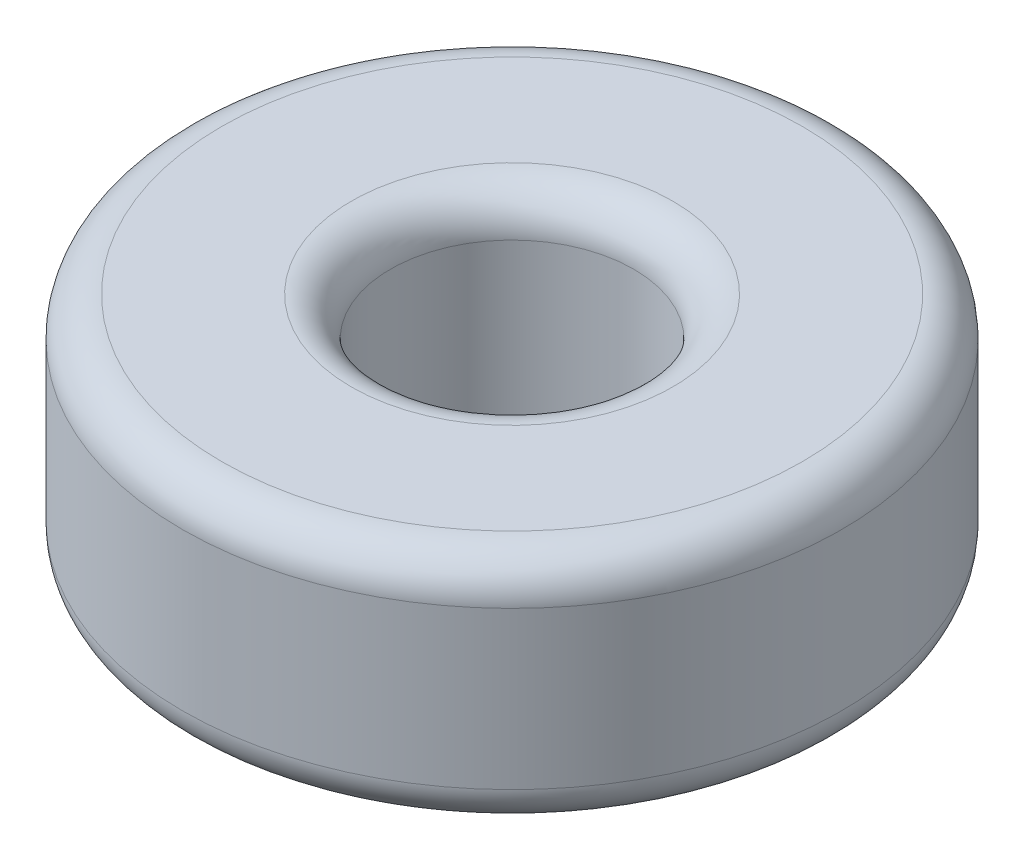
ISO-10303-21;
HEADER;
FILE_DESCRIPTION(('STEP AP214'),'2;1');
FILE_NAME('part.step','',(''),(''),'','','');
FILE_SCHEMA(('AUTOMOTIVE_DESIGN { 1 0 10303 214 1 1 1 1 }'));
ENDSEC;
DATA;
#1=APPLICATION_CONTEXT('core data for automotive mechanical design processes');
#2=APPLICATION_PROTOCOL_DEFINITION('international standard','automotive_design',2000,#1);
#3=PRODUCT_CONTEXT('',#1,'mechanical');
#4=PRODUCT('Part','Part','',(#3));
#5=PRODUCT_RELATED_PRODUCT_CATEGORY('part','',(#4));
#6=PRODUCT_DEFINITION_FORMATION('','',#4);
#7=PRODUCT_DEFINITION_CONTEXT('part definition',#1,'design');
#8=PRODUCT_DEFINITION('design','',#6,#7);
#9=PRODUCT_DEFINITION_SHAPE('','',#8);
#10=(LENGTH_UNIT() NAMED_UNIT(*) SI_UNIT(.MILLI.,.METRE.));
#11=(NAMED_UNIT(*) PLANE_ANGLE_UNIT() SI_UNIT($,.RADIAN.));
#12=(NAMED_UNIT(*) SI_UNIT($,.STERADIAN.) SOLID_ANGLE_UNIT());
#13=UNCERTAINTY_MEASURE_WITH_UNIT(LENGTH_MEASURE(1.E-05),#10,'distance_accuracy_value','');
#14=(GEOMETRIC_REPRESENTATION_CONTEXT(3) GLOBAL_UNCERTAINTY_ASSIGNED_CONTEXT((#13)) GLOBAL_UNIT_ASSIGNED_CONTEXT((#10,
#11,#12)) REPRESENTATION_CONTEXT('',''));
#15=CARTESIAN_POINT('',(0.,0.,0.));
#16=DIRECTION('',(0.,0.,1.));
#17=DIRECTION('',(1.,0.,0.));
#18=AXIS2_PLACEMENT_3D('',#15,#16,#17);
#19=CARTESIAN_POINT('',(0.,6.,0.));
#20=DIRECTION('',(0.,1.,0.));
#21=DIRECTION('',(0.,0.,1.));
#22=AXIS2_PLACEMENT_3D('',#19,#20,#21);
#23=PLANE('',#22);
#24=CARTESIAN_POINT('',(0.,6.,0.));
#25=DIRECTION('',(0.,1.,0.));
#26=DIRECTION('',(0.,0.,1.));
#27=AXIS2_PLACEMENT_3D('',#24,#25,#26);
#28=CIRCLE('',#27,4.1);
#29=CARTESIAN_POINT('',(0.,6.,4.1));
#30=VERTEX_POINT('',#29);
#31=EDGE_CURVE('E10',#30,#30,#28,.F.);
#32=ORIENTED_EDGE('',*,*,#31,.T.);
#33=EDGE_LOOP('',(#32));
#34=FACE_BOUND('',#33,.T.);
#35=CARTESIAN_POINT('',(0.,6.,0.));
#36=DIRECTION('',(0.,1.,0.));
#37=DIRECTION('',(0.,0.,1.));
#38=AXIS2_PLACEMENT_3D('',#35,#36,#37);
#39=CIRCLE('',#38,7.4);
#40=CARTESIAN_POINT('',(0.,6.,7.4));
#41=VERTEX_POINT('',#40);
#42=EDGE_CURVE('E38',#41,#41,#39,.T.);
#43=ORIENTED_EDGE('',*,*,#42,.T.);
#44=EDGE_LOOP('',(#43));
#45=FACE_BOUND('',#44,.T.);
#46=ADVANCED_FACE('F31',(#34,#45),#23,.T.);
#47=CARTESIAN_POINT('',(0.,0.,0.));
#48=DIRECTION('',(0.,1.,0.));
#49=DIRECTION('',(0.,0.,1.));
#50=AXIS2_PLACEMENT_3D('',#47,#48,#49);
#51=PLANE('',#50);
#52=CARTESIAN_POINT('',(0.,0.,0.));
#53=DIRECTION('',(0.,1.,0.));
#54=DIRECTION('',(0.,0.,1.));
#55=AXIS2_PLACEMENT_3D('',#52,#53,#54);
#56=CIRCLE('',#55,4.1);
#57=CARTESIAN_POINT('',(0.,0.,4.1));
#58=VERTEX_POINT('',#57);
#59=EDGE_CURVE('E57',#58,#58,#56,.T.);
#60=ORIENTED_EDGE('',*,*,#59,.T.);
#61=EDGE_LOOP('',(#60));
#62=FACE_BOUND('',#61,.T.);
#63=CARTESIAN_POINT('',(0.,0.,0.));
#64=DIRECTION('',(0.,1.,0.));
#65=DIRECTION('',(0.,0.,1.));
#66=AXIS2_PLACEMENT_3D('',#63,#64,#65);
#67=CIRCLE('',#66,7.4);
#68=CARTESIAN_POINT('',(0.,0.,7.4));
#69=VERTEX_POINT('',#68);
#70=EDGE_CURVE('E60',#69,#69,#67,.F.);
#71=ORIENTED_EDGE('',*,*,#70,.T.);
#72=EDGE_LOOP('',(#71));
#73=FACE_BOUND('',#72,.T.);
#74=ADVANCED_FACE('F64',(#62,#73),#51,.F.);
#75=CARTESIAN_POINT('',(0.,6.,0.));
#76=DIRECTION('',(0.,-1.,0.));
#77=DIRECTION('',(0.,0.,-1.));
#78=AXIS2_PLACEMENT_3D('',#75,#76,#77);
#79=CYLINDRICAL_SURFACE('',#78,8.4);
#80=CARTESIAN_POINT('',(0.,1.,0.));
#81=DIRECTION('',(0.,1.,0.));
#82=DIRECTION('',(0.,0.,1.));
#83=AXIS2_PLACEMENT_3D('',#80,#81,#82);
#84=CIRCLE('',#83,8.4);
#85=CARTESIAN_POINT('',(0.,1.,8.4));
#86=VERTEX_POINT('',#85);
#87=EDGE_CURVE('E42',#86,#86,#84,.T.);
#88=ORIENTED_EDGE('',*,*,#87,.T.);
#89=EDGE_LOOP('',(#88));
#90=FACE_BOUND('',#89,.T.);
#91=CARTESIAN_POINT('',(0.,5.,0.));
#92=DIRECTION('',(0.,1.,0.));
#93=DIRECTION('',(0.,0.,1.));
#94=AXIS2_PLACEMENT_3D('',#91,#92,#93);
#95=CIRCLE('',#94,8.4);
#96=CARTESIAN_POINT('',(0.,5.,8.4));
#97=VERTEX_POINT('',#96);
#98=EDGE_CURVE('E46',#97,#97,#95,.F.);
#99=ORIENTED_EDGE('',*,*,#98,.T.);
#100=EDGE_LOOP('',(#99));
#101=FACE_BOUND('',#100,.T.);
#102=ADVANCED_FACE('F74',(#90,#101),#79,.T.);
#103=CARTESIAN_POINT('',(0.,6.,0.));
#104=DIRECTION('',(0.,-1.,0.));
#105=DIRECTION('',(0.,0.,-1.));
#106=AXIS2_PLACEMENT_3D('',#103,#104,#105);
#107=CYLINDRICAL_SURFACE('',#106,3.1);
#108=CARTESIAN_POINT('',(0.,1.,0.));
#109=DIRECTION('',(0.,1.,0.));
#110=DIRECTION('',(0.,0.,1.));
#111=AXIS2_PLACEMENT_3D('',#108,#109,#110);
#112=CIRCLE('',#111,3.1);
#113=CARTESIAN_POINT('',(0.,1.,3.1));
#114=VERTEX_POINT('',#113);
#115=EDGE_CURVE('E51',#114,#114,#112,.F.);
#116=ORIENTED_EDGE('',*,*,#115,.T.);
#117=EDGE_LOOP('',(#116));
#118=FACE_BOUND('',#117,.T.);
#119=CARTESIAN_POINT('',(0.,5.,0.));
#120=DIRECTION('',(0.,1.,0.));
#121=DIRECTION('',(0.,0.,1.));
#122=AXIS2_PLACEMENT_3D('',#119,#120,#121);
#123=CIRCLE('',#122,3.1);
#124=CARTESIAN_POINT('',(0.,5.,3.1));
#125=VERTEX_POINT('',#124);
#126=EDGE_CURVE('E54',#125,#125,#123,.T.);
#127=ORIENTED_EDGE('',*,*,#126,.T.);
#128=EDGE_LOOP('',(#127));
#129=FACE_BOUND('',#128,.T.);
#130=ADVANCED_FACE('F77',(#118,#129),#107,.F.);
#131=CARTESIAN_POINT('',(0.,1.,0.));
#132=DIRECTION('',(0.,1.,0.));
#133=DIRECTION('',(0.,0.,1.));
#134=AXIS2_PLACEMENT_3D('',#131,#132,#133);
#135=TOROIDAL_SURFACE('',#134,4.1,1.);
#136=ORIENTED_EDGE('',*,*,#115,.F.);
#137=EDGE_LOOP('',(#136));
#138=FACE_BOUND('',#137,.T.);
#139=ORIENTED_EDGE('',*,*,#59,.F.);
#140=EDGE_LOOP('',(#139));
#141=FACE_BOUND('',#140,.T.);
#142=ADVANCED_FACE('F70',(#138,#141),#135,.T.);
#143=CARTESIAN_POINT('',(0.,1.,0.));
#144=DIRECTION('',(0.,1.,0.));
#145=DIRECTION('',(0.,0.,1.));
#146=AXIS2_PLACEMENT_3D('',#143,#144,#145);
#147=TOROIDAL_SURFACE('',#146,7.4,1.);
#148=ORIENTED_EDGE('',*,*,#70,.F.);
#149=EDGE_LOOP('',(#148));
#150=FACE_BOUND('',#149,.T.);
#151=ORIENTED_EDGE('',*,*,#87,.F.);
#152=EDGE_LOOP('',(#151));
#153=FACE_BOUND('',#152,.T.);
#154=ADVANCED_FACE('F66',(#150,#153),#147,.T.);
#155=CARTESIAN_POINT('',(0.,5.,0.));
#156=DIRECTION('',(0.,1.,0.));
#157=DIRECTION('',(0.,0.,1.));
#158=AXIS2_PLACEMENT_3D('',#155,#156,#157);
#159=TOROIDAL_SURFACE('',#158,4.1,1.);
#160=ORIENTED_EDGE('',*,*,#31,.F.);
#161=EDGE_LOOP('',(#160));
#162=FACE_BOUND('',#161,.T.);
#163=ORIENTED_EDGE('',*,*,#126,.F.);
#164=EDGE_LOOP('',(#163));
#165=FACE_BOUND('',#164,.T.);
#166=ADVANCED_FACE('F69',(#162,#165),#159,.T.);
#167=CARTESIAN_POINT('',(0.,5.,0.));
#168=DIRECTION('',(0.,1.,0.));
#169=DIRECTION('',(0.,0.,1.));
#170=AXIS2_PLACEMENT_3D('',#167,#168,#169);
#171=TOROIDAL_SURFACE('',#170,7.4,1.);
#172=ORIENTED_EDGE('',*,*,#98,.F.);
#173=EDGE_LOOP('',(#172));
#174=FACE_BOUND('',#173,.T.);
#175=ORIENTED_EDGE('',*,*,#42,.F.);
#176=EDGE_LOOP('',(#175));
#177=FACE_BOUND('',#176,.T.);
#178=ADVANCED_FACE('F33',(#174,#177),#171,.T.);
#179=CLOSED_SHELL('',(#46,#74,#102,#130,#142,#154,#166,#178));
#180=MANIFOLD_SOLID_BREP('B2',#179);
#181=ADVANCED_BREP_SHAPE_REPRESENTATION('',(#18,#180),#14);
#182=SHAPE_DEFINITION_REPRESENTATION(#9,#181);
ENDSEC;
END-ISO-10303-21;
